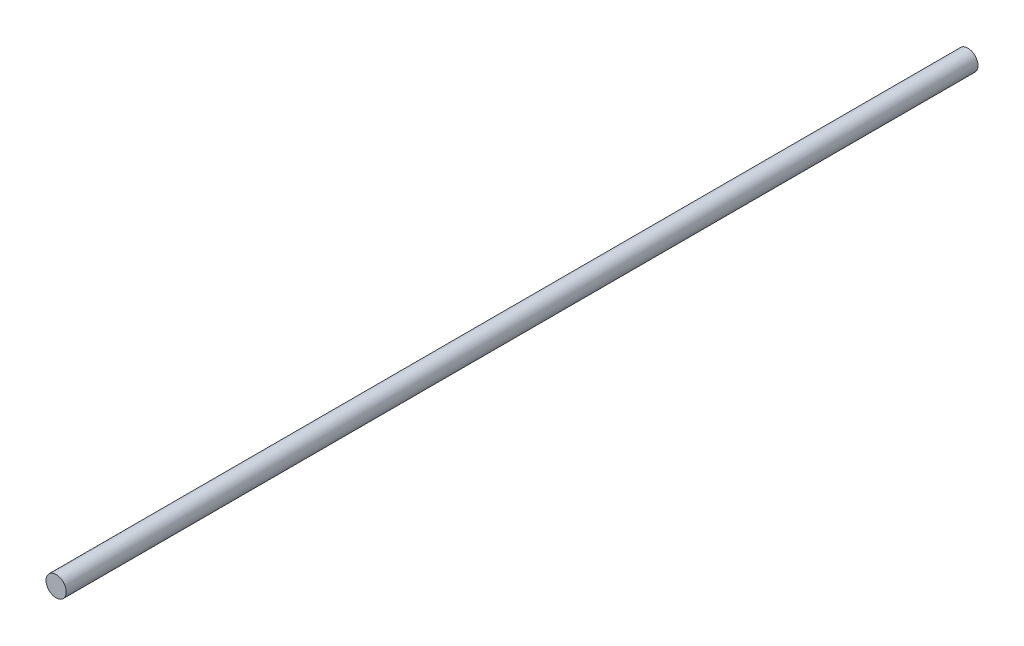
ISO-10303-21;
HEADER;
FILE_DESCRIPTION(('STEP AP214'),'2;1');
FILE_NAME('part.step','',(''),(''),'','','');
FILE_SCHEMA(('AUTOMOTIVE_DESIGN { 1 0 10303 214 1 1 1 1 }'));
ENDSEC;
DATA;
#1=APPLICATION_CONTEXT('core data for automotive mechanical design processes');
#2=APPLICATION_PROTOCOL_DEFINITION('international standard','automotive_design',2000,#1);
#3=PRODUCT_CONTEXT('',#1,'mechanical');
#4=PRODUCT('Part','Part','',(#3));
#5=PRODUCT_RELATED_PRODUCT_CATEGORY('part','',(#4));
#6=PRODUCT_DEFINITION_FORMATION('','',#4);
#7=PRODUCT_DEFINITION_CONTEXT('part definition',#1,'design');
#8=PRODUCT_DEFINITION('design','',#6,#7);
#9=PRODUCT_DEFINITION_SHAPE('','',#8);
#10=(LENGTH_UNIT() NAMED_UNIT(*) SI_UNIT(.MILLI.,.METRE.));
#11=(NAMED_UNIT(*) PLANE_ANGLE_UNIT() SI_UNIT($,.RADIAN.));
#12=(NAMED_UNIT(*) SI_UNIT($,.STERADIAN.) SOLID_ANGLE_UNIT());
#13=UNCERTAINTY_MEASURE_WITH_UNIT(LENGTH_MEASURE(1.E-05),#10,'distance_accuracy_value','');
#14=(GEOMETRIC_REPRESENTATION_CONTEXT(3) GLOBAL_UNCERTAINTY_ASSIGNED_CONTEXT((#13)) GLOBAL_UNIT_ASSIGNED_CONTEXT((#10,
#11,#12)) REPRESENTATION_CONTEXT('',''));
#15=CARTESIAN_POINT('',(0.,0.,0.));
#16=DIRECTION('',(0.,0.,1.));
#17=DIRECTION('',(1.,0.,0.));
#18=AXIS2_PLACEMENT_3D('',#15,#16,#17);
#19=CARTESIAN_POINT('',(0.,0.,45.));
#20=DIRECTION('',(0.,0.,-1.));
#21=DIRECTION('',(-1.,0.,0.));
#22=AXIS2_PLACEMENT_3D('',#19,#20,#21);
#23=CYLINDRICAL_SURFACE('',#22,0.5);
#24=CARTESIAN_POINT('',(0.,0.,45.));
#25=DIRECTION('',(0.,0.,1.));
#26=DIRECTION('',(1.,0.,0.));
#27=AXIS2_PLACEMENT_3D('',#24,#25,#26);
#28=CIRCLE('',#27,0.5);
#29=CARTESIAN_POINT('',(0.5,0.,45.));
#30=VERTEX_POINT('',#29);
#31=EDGE_CURVE('E10',#30,#30,#28,.T.);
#32=ORIENTED_EDGE('',*,*,#31,.F.);
#33=EDGE_LOOP('',(#32));
#34=FACE_BOUND('',#33,.T.);
#35=CARTESIAN_POINT('',(0.,0.,0.));
#36=DIRECTION('',(0.,0.,1.));
#37=DIRECTION('',(1.,0.,0.));
#38=AXIS2_PLACEMENT_3D('',#35,#36,#37);
#39=CIRCLE('',#38,0.5);
#40=CARTESIAN_POINT('',(0.5,0.,0.));
#41=VERTEX_POINT('',#40);
#42=EDGE_CURVE('E38',#41,#41,#39,.T.);
#43=ORIENTED_EDGE('',*,*,#42,.T.);
#44=EDGE_LOOP('',(#43));
#45=FACE_BOUND('',#44,.T.);
#46=ADVANCED_FACE('F35',(#34,#45),#23,.T.);
#47=CARTESIAN_POINT('',(0.,0.,45.));
#48=DIRECTION('',(0.,0.,1.));
#49=DIRECTION('',(1.,0.,0.));
#50=AXIS2_PLACEMENT_3D('',#47,#48,#49);
#51=PLANE('',#50);
#52=ORIENTED_EDGE('',*,*,#31,.T.);
#53=EDGE_LOOP('',(#52));
#54=FACE_BOUND('',#53,.T.);
#55=ADVANCED_FACE('F50',(#54),#51,.T.);
#56=CARTESIAN_POINT('',(0.,0.,0.));
#57=DIRECTION('',(0.,0.,1.));
#58=DIRECTION('',(1.,0.,0.));
#59=AXIS2_PLACEMENT_3D('',#56,#57,#58);
#60=PLANE('',#59);
#61=ORIENTED_EDGE('',*,*,#42,.F.);
#62=EDGE_LOOP('',(#61));
#63=FACE_BOUND('',#62,.T.);
#64=ADVANCED_FACE('F48',(#63),#60,.F.);
#65=CLOSED_SHELL('',(#46,#55,#64));
#66=MANIFOLD_SOLID_BREP('B2',#65);
#67=ADVANCED_BREP_SHAPE_REPRESENTATION('',(#18,#66),#14);
#68=SHAPE_DEFINITION_REPRESENTATION(#9,#67);
ENDSEC;
END-ISO-10303-21;
